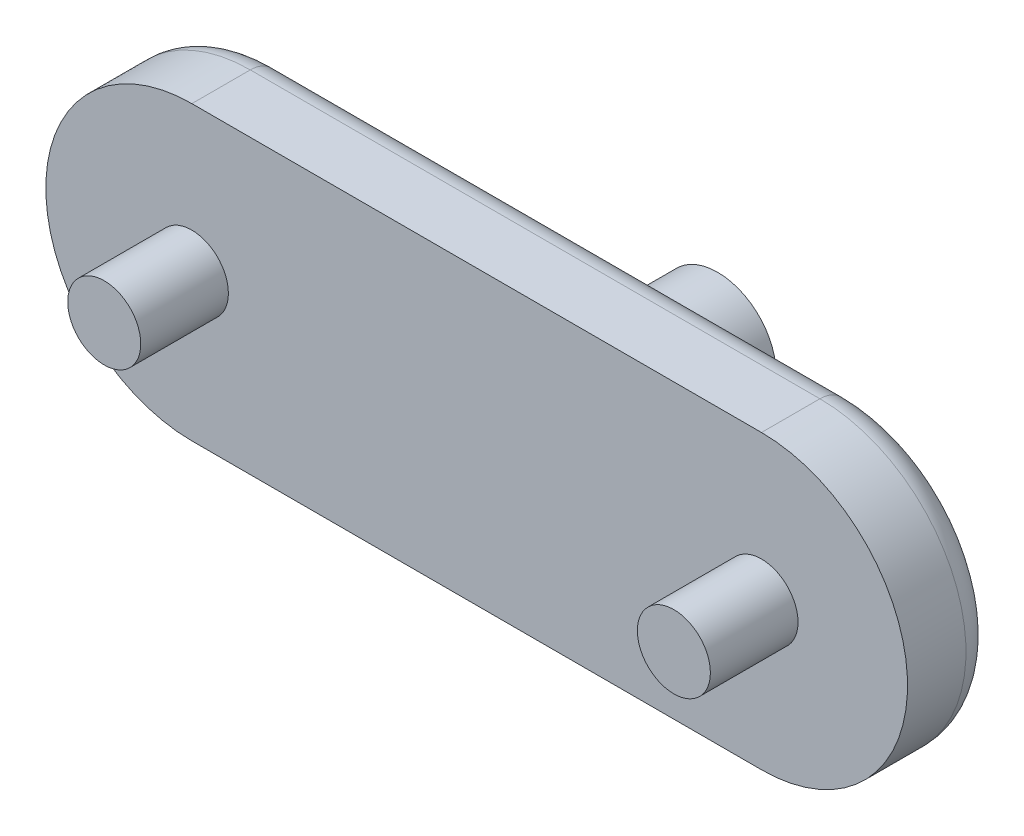
ISO-10303-21;
HEADER;
FILE_DESCRIPTION(('STEP AP214'),'2;1');
FILE_NAME('part.step','',(''),(''),'','','');
FILE_SCHEMA(('AUTOMOTIVE_DESIGN { 1 0 10303 214 1 1 1 1 }'));
ENDSEC;
DATA;
#1=APPLICATION_CONTEXT('core data for automotive mechanical design processes');
#2=APPLICATION_PROTOCOL_DEFINITION('international standard','automotive_design',2000,#1);
#3=PRODUCT_CONTEXT('',#1,'mechanical');
#4=PRODUCT('Part','Part','',(#3));
#5=PRODUCT_RELATED_PRODUCT_CATEGORY('part','',(#4));
#6=PRODUCT_DEFINITION_FORMATION('','',#4);
#7=PRODUCT_DEFINITION_CONTEXT('part definition',#1,'design');
#8=PRODUCT_DEFINITION('design','',#6,#7);
#9=PRODUCT_DEFINITION_SHAPE('','',#8);
#10=(LENGTH_UNIT() NAMED_UNIT(*) SI_UNIT(.MILLI.,.METRE.));
#11=(NAMED_UNIT(*) PLANE_ANGLE_UNIT() SI_UNIT($,.RADIAN.));
#12=(NAMED_UNIT(*) SI_UNIT($,.STERADIAN.) SOLID_ANGLE_UNIT());
#13=UNCERTAINTY_MEASURE_WITH_UNIT(LENGTH_MEASURE(1.E-05),#10,'distance_accuracy_value','');
#14=(GEOMETRIC_REPRESENTATION_CONTEXT(3) GLOBAL_UNCERTAINTY_ASSIGNED_CONTEXT((#13)) GLOBAL_UNIT_ASSIGNED_CONTEXT((#10,
#11,#12)) REPRESENTATION_CONTEXT('',''));
#15=CARTESIAN_POINT('',(0.,0.,0.));
#16=DIRECTION('',(0.,0.,1.));
#17=DIRECTION('',(1.,0.,0.));
#18=AXIS2_PLACEMENT_3D('',#15,#16,#17);
#19=CARTESIAN_POINT('',(0.,0.,3.));
#20=DIRECTION('',(0.,0.,-1.));
#21=DIRECTION('',(-1.,0.,0.));
#22=AXIS2_PLACEMENT_3D('',#19,#20,#21);
#23=CYLINDRICAL_SURFACE('',#22,5.);
#24=DIRECTION('',(0.,0.,-1.));
#25=VECTOR('',#24,1.);
#26=CARTESIAN_POINT('',(0.,-5.,3.));
#27=LINE('',#26,#25);
#28=CARTESIAN_POINT('',(0.,-5.,3.));
#29=VERTEX_POINT('',#28);
#30=CARTESIAN_POINT('',(0.,-5.,1.));
#31=VERTEX_POINT('',#30);
#32=EDGE_CURVE('E191',#29,#31,#27,.T.);
#33=ORIENTED_EDGE('',*,*,#32,.T.);
#34=CARTESIAN_POINT('',(0.,0.,1.));
#35=DIRECTION('',(0.,0.,1.));
#36=DIRECTION('',(1.,0.,0.));
#37=AXIS2_PLACEMENT_3D('',#34,#35,#36);
#38=CIRCLE('',#37,5.);
#39=CARTESIAN_POINT('',(0.,5.,1.));
#40=VERTEX_POINT('',#39);
#41=EDGE_CURVE('E116',#31,#40,#38,.T.);
#42=ORIENTED_EDGE('',*,*,#41,.T.);
#43=DIRECTION('',(0.,0.,-1.));
#44=VECTOR('',#43,1.);
#45=CARTESIAN_POINT('',(0.,5.,3.));
#46=LINE('',#45,#44);
#47=CARTESIAN_POINT('',(0.,5.,3.));
#48=VERTEX_POINT('',#47);
#49=EDGE_CURVE('E96',#48,#40,#46,.T.);
#50=ORIENTED_EDGE('',*,*,#49,.F.);
#51=CARTESIAN_POINT('',(0.,0.,3.));
#52=DIRECTION('',(0.,0.,1.));
#53=DIRECTION('',(1.,0.,0.));
#54=AXIS2_PLACEMENT_3D('',#51,#52,#53);
#55=CIRCLE('',#54,5.);
#56=EDGE_CURVE('E102',#29,#48,#55,.T.);
#57=ORIENTED_EDGE('',*,*,#56,.F.);
#58=EDGE_LOOP('',(#33,#42,#50,#57));
#59=FACE_BOUND('',#58,.T.);
#60=ADVANCED_FACE('F39',(#59),#23,.T.);
#61=CARTESIAN_POINT('',(0.,5.,3.));
#62=DIRECTION('',(0.,-1.,0.));
#63=DIRECTION('',(1.,0.,0.));
#64=AXIS2_PLACEMENT_3D('',#61,#62,#63);
#65=PLANE('',#64);
#66=ORIENTED_EDGE('',*,*,#49,.T.);
#67=DIRECTION('',(-1.,0.,0.));
#68=VECTOR('',#67,1.);
#69=CARTESIAN_POINT('',(0.,5.,1.));
#70=LINE('',#69,#68);
#71=CARTESIAN_POINT('',(-19.5,5.,1.));
#72=VERTEX_POINT('',#71);
#73=EDGE_CURVE('E11',#40,#72,#70,.T.);
#74=ORIENTED_EDGE('',*,*,#73,.T.);
#75=DIRECTION('',(0.,0.,-1.));
#76=VECTOR('',#75,1.);
#77=CARTESIAN_POINT('',(-19.5,5.,3.));
#78=LINE('',#77,#76);
#79=CARTESIAN_POINT('',(-19.5,5.,3.));
#80=VERTEX_POINT('',#79);
#81=EDGE_CURVE('E97',#80,#72,#78,.T.);
#82=ORIENTED_EDGE('',*,*,#81,.F.);
#83=DIRECTION('',(-1.,0.,0.));
#84=VECTOR('',#83,1.);
#85=CARTESIAN_POINT('',(0.,5.,3.));
#86=LINE('',#85,#84);
#87=EDGE_CURVE('E92',#48,#80,#86,.T.);
#88=ORIENTED_EDGE('',*,*,#87,.F.);
#89=EDGE_LOOP('',(#66,#74,#82,#88));
#90=FACE_BOUND('',#89,.T.);
#91=ADVANCED_FACE('F94',(#90),#65,.F.);
#92=CARTESIAN_POINT('',(-19.5,0.,3.));
#93=DIRECTION('',(0.,0.,-1.));
#94=DIRECTION('',(-1.,0.,0.));
#95=AXIS2_PLACEMENT_3D('',#92,#93,#94);
#96=CYLINDRICAL_SURFACE('',#95,5.);
#97=ORIENTED_EDGE('',*,*,#81,.T.);
#98=CARTESIAN_POINT('',(-19.5,0.,1.));
#99=DIRECTION('',(0.,0.,1.));
#100=DIRECTION('',(1.,0.,0.));
#101=AXIS2_PLACEMENT_3D('',#98,#99,#100);
#102=CIRCLE('',#101,5.);
#103=CARTESIAN_POINT('',(-19.5,-5.,1.));
#104=VERTEX_POINT('',#103);
#105=EDGE_CURVE('E49',#72,#104,#102,.T.);
#106=ORIENTED_EDGE('',*,*,#105,.T.);
#107=DIRECTION('',(0.,0.,-1.));
#108=VECTOR('',#107,1.);
#109=CARTESIAN_POINT('',(-19.5,-5.,3.));
#110=LINE('',#109,#108);
#111=CARTESIAN_POINT('',(-19.5,-5.,3.));
#112=VERTEX_POINT('',#111);
#113=EDGE_CURVE('E124',#112,#104,#110,.T.);
#114=ORIENTED_EDGE('',*,*,#113,.F.);
#115=CARTESIAN_POINT('',(-19.5,0.,3.));
#116=DIRECTION('',(0.,0.,1.));
#117=DIRECTION('',(1.,0.,0.));
#118=AXIS2_PLACEMENT_3D('',#115,#116,#117);
#119=CIRCLE('',#118,5.);
#120=EDGE_CURVE('E101',#80,#112,#119,.T.);
#121=ORIENTED_EDGE('',*,*,#120,.F.);
#122=EDGE_LOOP('',(#97,#106,#114,#121));
#123=FACE_BOUND('',#122,.T.);
#124=ADVANCED_FACE('F217',(#123),#96,.T.);
#125=CARTESIAN_POINT('',(0.,-5.,3.));
#126=DIRECTION('',(0.,1.,0.));
#127=DIRECTION('',(-1.,0.,0.));
#128=AXIS2_PLACEMENT_3D('',#125,#126,#127);
#129=PLANE('',#128);
#130=ORIENTED_EDGE('',*,*,#113,.T.);
#131=DIRECTION('',(1.,0.,0.));
#132=VECTOR('',#131,1.);
#133=CARTESIAN_POINT('',(0.,-5.,1.));
#134=LINE('',#133,#132);
#135=EDGE_CURVE('E143',#104,#31,#134,.T.);
#136=ORIENTED_EDGE('',*,*,#135,.T.);
#137=ORIENTED_EDGE('',*,*,#32,.F.);
#138=DIRECTION('',(1.,0.,0.));
#139=VECTOR('',#138,1.);
#140=CARTESIAN_POINT('',(0.,-5.,3.));
#141=LINE('',#140,#139);
#142=EDGE_CURVE('E107',#112,#29,#141,.T.);
#143=ORIENTED_EDGE('',*,*,#142,.F.);
#144=EDGE_LOOP('',(#130,#136,#137,#143));
#145=FACE_BOUND('',#144,.T.);
#146=ADVANCED_FACE('F195',(#145),#129,.F.);
#147=CARTESIAN_POINT('',(0.,0.,3.));
#148=DIRECTION('',(0.,0.,1.));
#149=DIRECTION('',(1.,0.,0.));
#150=AXIS2_PLACEMENT_3D('',#147,#148,#149);
#151=PLANE('',#150);
#152=CARTESIAN_POINT('',(0.,0.,3.));
#153=DIRECTION('',(0.,0.,1.));
#154=DIRECTION('',(1.,0.,0.));
#155=AXIS2_PLACEMENT_3D('',#152,#153,#154);
#156=CIRCLE('',#155,1.25);
#157=CARTESIAN_POINT('',(1.25,0.,3.));
#158=VERTEX_POINT('',#157);
#159=EDGE_CURVE('E168',#158,#158,#156,.T.);
#160=ORIENTED_EDGE('',*,*,#159,.F.);
#161=EDGE_LOOP('',(#160));
#162=FACE_BOUND('',#161,.T.);
#163=CARTESIAN_POINT('',(-19.5,0.,3.));
#164=DIRECTION('',(0.,0.,1.));
#165=DIRECTION('',(1.,0.,0.));
#166=AXIS2_PLACEMENT_3D('',#163,#164,#165);
#167=CIRCLE('',#166,1.25);
#168=CARTESIAN_POINT('',(-18.25,0.,3.));
#169=VERTEX_POINT('',#168);
#170=EDGE_CURVE('E179',#169,#169,#167,.T.);
#171=ORIENTED_EDGE('',*,*,#170,.F.);
#172=EDGE_LOOP('',(#171));
#173=FACE_BOUND('',#172,.T.);
#174=ORIENTED_EDGE('',*,*,#56,.T.);
#175=ORIENTED_EDGE('',*,*,#87,.T.);
#176=ORIENTED_EDGE('',*,*,#120,.T.);
#177=ORIENTED_EDGE('',*,*,#142,.T.);
#178=EDGE_LOOP('',(#174,#175,#176,#177));
#179=FACE_BOUND('',#178,.T.);
#180=ADVANCED_FACE('F105',(#162,#173,#179),#151,.T.);
#181=CARTESIAN_POINT('',(0.,0.,0.));
#182=DIRECTION('',(0.,0.,1.));
#183=DIRECTION('',(1.,0.,0.));
#184=AXIS2_PLACEMENT_3D('',#181,#182,#183);
#185=PLANE('',#184);
#186=DIRECTION('',(-1.,0.,0.));
#187=VECTOR('',#186,1.);
#188=CARTESIAN_POINT('',(0.,4.,0.));
#189=LINE('',#188,#187);
#190=CARTESIAN_POINT('',(-19.5,4.,0.));
#191=VERTEX_POINT('',#190);
#192=CARTESIAN_POINT('',(0.,4.,0.));
#193=VERTEX_POINT('',#192);
#194=EDGE_CURVE('E130',#191,#193,#189,.F.);
#195=ORIENTED_EDGE('',*,*,#194,.T.);
#196=CARTESIAN_POINT('',(0.,0.,0.));
#197=DIRECTION('',(0.,0.,1.));
#198=DIRECTION('',(1.,0.,0.));
#199=AXIS2_PLACEMENT_3D('',#196,#197,#198);
#200=CIRCLE('',#199,4.);
#201=CARTESIAN_POINT('',(0.,-4.,0.));
#202=VERTEX_POINT('',#201);
#203=EDGE_CURVE('E139',#193,#202,#200,.F.);
#204=ORIENTED_EDGE('',*,*,#203,.T.);
#205=DIRECTION('',(1.,0.,0.));
#206=VECTOR('',#205,1.);
#207=CARTESIAN_POINT('',(0.,-4.,0.));
#208=LINE('',#207,#206);
#209=CARTESIAN_POINT('',(-19.5,-4.,0.));
#210=VERTEX_POINT('',#209);
#211=EDGE_CURVE('E136',#202,#210,#208,.F.);
#212=ORIENTED_EDGE('',*,*,#211,.T.);
#213=CARTESIAN_POINT('',(-19.5,0.,0.));
#214=DIRECTION('',(0.,0.,1.));
#215=DIRECTION('',(1.,0.,0.));
#216=AXIS2_PLACEMENT_3D('',#213,#214,#215);
#217=CIRCLE('',#216,4.);
#218=EDGE_CURVE('E133',#210,#191,#217,.F.);
#219=ORIENTED_EDGE('',*,*,#218,.T.);
#220=EDGE_LOOP('',(#195,#204,#212,#219));
#221=FACE_BOUND('',#220,.T.);
#222=CARTESIAN_POINT('',(-8.5,0.,0.));
#223=DIRECTION('',(0.,0.,1.));
#224=DIRECTION('',(1.,0.,0.));
#225=AXIS2_PLACEMENT_3D('',#222,#223,#224);
#226=CIRCLE('',#225,2.);
#227=CARTESIAN_POINT('',(-6.5,0.,0.));
#228=VERTEX_POINT('',#227);
#229=EDGE_CURVE('E118',#228,#228,#226,.F.);
#230=ORIENTED_EDGE('',*,*,#229,.F.);
#231=EDGE_LOOP('',(#230));
#232=FACE_BOUND('',#231,.T.);
#233=ADVANCED_FACE('F224',(#221,#232),#185,.F.);
#234=CARTESIAN_POINT('',(-19.5,0.,6.));
#235=DIRECTION('',(0.,0.,-1.));
#236=DIRECTION('',(-1.,0.,0.));
#237=AXIS2_PLACEMENT_3D('',#234,#235,#236);
#238=CYLINDRICAL_SURFACE('',#237,1.25);
#239=CARTESIAN_POINT('',(-19.5,0.,6.));
#240=DIRECTION('',(0.,0.,1.));
#241=DIRECTION('',(1.,0.,0.));
#242=AXIS2_PLACEMENT_3D('',#239,#240,#241);
#243=CIRCLE('',#242,1.25);
#244=CARTESIAN_POINT('',(-18.25,0.,6.));
#245=VERTEX_POINT('',#244);
#246=EDGE_CURVE('E112',#245,#245,#243,.T.);
#247=ORIENTED_EDGE('',*,*,#246,.F.);
#248=EDGE_LOOP('',(#247));
#249=FACE_BOUND('',#248,.T.);
#250=ORIENTED_EDGE('',*,*,#170,.T.);
#251=EDGE_LOOP('',(#250));
#252=FACE_BOUND('',#251,.T.);
#253=ADVANCED_FACE('F227',(#249,#252),#238,.T.);
#254=CARTESIAN_POINT('',(-19.5,0.,6.));
#255=DIRECTION('',(0.,0.,1.));
#256=DIRECTION('',(1.,0.,0.));
#257=AXIS2_PLACEMENT_3D('',#254,#255,#256);
#258=PLANE('',#257);
#259=ORIENTED_EDGE('',*,*,#246,.T.);
#260=EDGE_LOOP('',(#259));
#261=FACE_BOUND('',#260,.T.);
#262=ADVANCED_FACE('F234',(#261),#258,.T.);
#263=CARTESIAN_POINT('',(0.,0.,6.));
#264=DIRECTION('',(0.,0.,-1.));
#265=DIRECTION('',(-1.,0.,0.));
#266=AXIS2_PLACEMENT_3D('',#263,#264,#265);
#267=CYLINDRICAL_SURFACE('',#266,1.25);
#268=CARTESIAN_POINT('',(0.,0.,6.));
#269=DIRECTION('',(0.,0.,1.));
#270=DIRECTION('',(1.,0.,0.));
#271=AXIS2_PLACEMENT_3D('',#268,#269,#270);
#272=CIRCLE('',#271,1.25);
#273=CARTESIAN_POINT('',(1.25,0.,6.));
#274=VERTEX_POINT('',#273);
#275=EDGE_CURVE('E174',#274,#274,#272,.T.);
#276=ORIENTED_EDGE('',*,*,#275,.F.);
#277=EDGE_LOOP('',(#276));
#278=FACE_BOUND('',#277,.T.);
#279=ORIENTED_EDGE('',*,*,#159,.T.);
#280=EDGE_LOOP('',(#279));
#281=FACE_BOUND('',#280,.T.);
#282=ADVANCED_FACE('F238',(#278,#281),#267,.T.);
#283=CARTESIAN_POINT('',(0.,0.,6.));
#284=DIRECTION('',(0.,0.,1.));
#285=DIRECTION('',(1.,0.,0.));
#286=AXIS2_PLACEMENT_3D('',#283,#284,#285);
#287=PLANE('',#286);
#288=ORIENTED_EDGE('',*,*,#275,.T.);
#289=EDGE_LOOP('',(#288));
#290=FACE_BOUND('',#289,.T.);
#291=ADVANCED_FACE('F242',(#290),#287,.T.);
#292=CARTESIAN_POINT('',(-8.5,0.,-4.));
#293=DIRECTION('',(0.,0.,1.));
#294=DIRECTION('',(1.,0.,0.));
#295=AXIS2_PLACEMENT_3D('',#292,#293,#294);
#296=CYLINDRICAL_SURFACE('',#295,2.);
#297=CARTESIAN_POINT('',(-8.5,0.,-4.));
#298=DIRECTION('',(0.,0.,-1.));
#299=DIRECTION('',(-1.,0.,0.));
#300=AXIS2_PLACEMENT_3D('',#297,#298,#299);
#301=CIRCLE('',#300,2.);
#302=CARTESIAN_POINT('',(-10.5,0.,-4.));
#303=VERTEX_POINT('',#302);
#304=EDGE_CURVE('E161',#303,#303,#301,.T.);
#305=ORIENTED_EDGE('',*,*,#304,.F.);
#306=EDGE_LOOP('',(#305));
#307=FACE_BOUND('',#306,.T.);
#308=ORIENTED_EDGE('',*,*,#229,.T.);
#309=EDGE_LOOP('',(#308));
#310=FACE_BOUND('',#309,.T.);
#311=ADVANCED_FACE('F246',(#307,#310),#296,.T.);
#312=CARTESIAN_POINT('',(-8.5,0.,-4.));
#313=DIRECTION('',(0.,0.,-1.));
#314=DIRECTION('',(-1.,0.,0.));
#315=AXIS2_PLACEMENT_3D('',#312,#313,#314);
#316=PLANE('',#315);
#317=ORIENTED_EDGE('',*,*,#304,.T.);
#318=EDGE_LOOP('',(#317));
#319=FACE_BOUND('',#318,.T.);
#320=ADVANCED_FACE('F250',(#319),#316,.T.);
#321=CARTESIAN_POINT('',(-19.5,0.,1.));
#322=DIRECTION('',(0.,0.,1.));
#323=DIRECTION('',(1.,0.,0.));
#324=AXIS2_PLACEMENT_3D('',#321,#322,#323);
#325=TOROIDAL_SURFACE('',#324,4.,1.);
#326=CARTESIAN_POINT('',(-19.5,4.,1.));
#327=DIRECTION('',(1.,0.,0.));
#328=DIRECTION('',(0.,0.,-1.));
#329=AXIS2_PLACEMENT_3D('',#326,#327,#328);
#330=CIRCLE('',#329,1.);
#331=EDGE_CURVE('E153',#191,#72,#330,.T.);
#332=ORIENTED_EDGE('',*,*,#331,.F.);
#333=ORIENTED_EDGE('',*,*,#218,.F.);
#334=CARTESIAN_POINT('',(-19.5,-4.,1.));
#335=DIRECTION('',(1.,0.,0.));
#336=DIRECTION('',(0.,0.,-1.));
#337=AXIS2_PLACEMENT_3D('',#334,#335,#336);
#338=CIRCLE('',#337,1.);
#339=EDGE_CURVE('E43',#104,#210,#338,.T.);
#340=ORIENTED_EDGE('',*,*,#339,.F.);
#341=ORIENTED_EDGE('',*,*,#105,.F.);
#342=EDGE_LOOP('',(#332,#333,#340,#341));
#343=FACE_BOUND('',#342,.T.);
#344=ADVANCED_FACE('F41',(#343),#325,.T.);
#345=CARTESIAN_POINT('',(0.,-4.,1.));
#346=DIRECTION('',(1.,0.,0.));
#347=DIRECTION('',(0.,1.,0.));
#348=AXIS2_PLACEMENT_3D('',#345,#346,#347);
#349=CYLINDRICAL_SURFACE('',#348,1.);
#350=ORIENTED_EDGE('',*,*,#339,.T.);
#351=ORIENTED_EDGE('',*,*,#211,.F.);
#352=CARTESIAN_POINT('',(0.,-4.,1.));
#353=DIRECTION('',(1.,0.,0.));
#354=DIRECTION('',(0.,1.,0.));
#355=AXIS2_PLACEMENT_3D('',#352,#353,#354);
#356=CIRCLE('',#355,1.);
#357=EDGE_CURVE('E151',#31,#202,#356,.T.);
#358=ORIENTED_EDGE('',*,*,#357,.F.);
#359=ORIENTED_EDGE('',*,*,#135,.F.);
#360=EDGE_LOOP('',(#350,#351,#358,#359));
#361=FACE_BOUND('',#360,.T.);
#362=ADVANCED_FACE('F199',(#361),#349,.T.);
#363=CARTESIAN_POINT('',(0.,4.,1.));
#364=DIRECTION('',(-1.,0.,0.));
#365=DIRECTION('',(0.,-1.,0.));
#366=AXIS2_PLACEMENT_3D('',#363,#364,#365);
#367=CYLINDRICAL_SURFACE('',#366,1.);
#368=ORIENTED_EDGE('',*,*,#331,.T.);
#369=ORIENTED_EDGE('',*,*,#73,.F.);
#370=CARTESIAN_POINT('',(0.,4.,1.));
#371=DIRECTION('',(1.,0.,0.));
#372=DIRECTION('',(0.,1.,0.));
#373=AXIS2_PLACEMENT_3D('',#370,#371,#372);
#374=CIRCLE('',#373,1.);
#375=EDGE_CURVE('E148',#193,#40,#374,.T.);
#376=ORIENTED_EDGE('',*,*,#375,.F.);
#377=ORIENTED_EDGE('',*,*,#194,.F.);
#378=EDGE_LOOP('',(#368,#369,#376,#377));
#379=FACE_BOUND('',#378,.T.);
#380=ADVANCED_FACE('F204',(#379),#367,.T.);
#381=CARTESIAN_POINT('',(0.,0.,1.));
#382=DIRECTION('',(0.,0.,1.));
#383=DIRECTION('',(1.,0.,0.));
#384=AXIS2_PLACEMENT_3D('',#381,#382,#383);
#385=TOROIDAL_SURFACE('',#384,4.,1.);
#386=ORIENTED_EDGE('',*,*,#357,.T.);
#387=ORIENTED_EDGE('',*,*,#203,.F.);
#388=ORIENTED_EDGE('',*,*,#375,.T.);
#389=ORIENTED_EDGE('',*,*,#41,.F.);
#390=EDGE_LOOP('',(#386,#387,#388,#389));
#391=FACE_BOUND('',#390,.T.);
#392=ADVANCED_FACE('F202',(#391),#385,.T.);
#393=CLOSED_SHELL('',(#60,#91,#124,#146,#180,#233,#253,#262,#282,#291,#311,#320,#344,#362,#380,#392));
#394=MANIFOLD_SOLID_BREP('B2',#393);
#395=ADVANCED_BREP_SHAPE_REPRESENTATION('',(#18,#394),#14);
#396=SHAPE_DEFINITION_REPRESENTATION(#9,#395);
ENDSEC;
END-ISO-10303-21;
